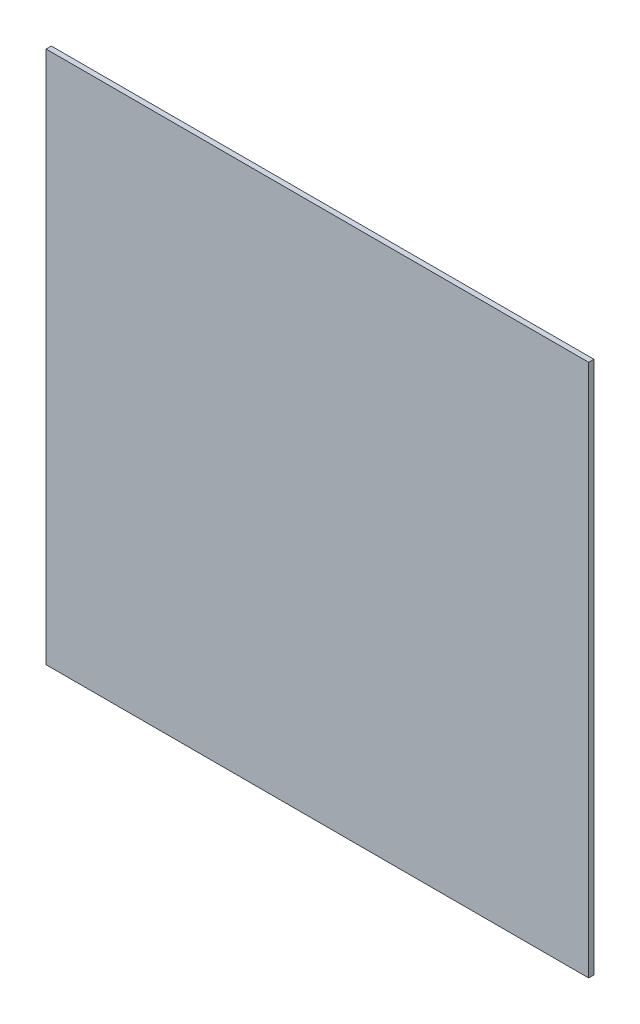
ISO-10303-21;
HEADER;
FILE_DESCRIPTION(('STEP AP214'),'2;1');
FILE_NAME('part.step','',(''),(''),'','','');
FILE_SCHEMA(('AUTOMOTIVE_DESIGN { 1 0 10303 214 1 1 1 1 }'));
ENDSEC;
DATA;
#1=APPLICATION_CONTEXT('core data for automotive mechanical design processes');
#2=APPLICATION_PROTOCOL_DEFINITION('international standard','automotive_design',2000,#1);
#3=PRODUCT_CONTEXT('',#1,'mechanical');
#4=PRODUCT('Part','Part','',(#3));
#5=PRODUCT_RELATED_PRODUCT_CATEGORY('part','',(#4));
#6=PRODUCT_DEFINITION_FORMATION('','',#4);
#7=PRODUCT_DEFINITION_CONTEXT('part definition',#1,'design');
#8=PRODUCT_DEFINITION('design','',#6,#7);
#9=PRODUCT_DEFINITION_SHAPE('','',#8);
#10=(LENGTH_UNIT() NAMED_UNIT(*) SI_UNIT(.MILLI.,.METRE.));
#11=(NAMED_UNIT(*) PLANE_ANGLE_UNIT() SI_UNIT($,.RADIAN.));
#12=(NAMED_UNIT(*) SI_UNIT($,.STERADIAN.) SOLID_ANGLE_UNIT());
#13=UNCERTAINTY_MEASURE_WITH_UNIT(LENGTH_MEASURE(1.E-05),#10,'distance_accuracy_value','');
#14=(GEOMETRIC_REPRESENTATION_CONTEXT(3) GLOBAL_UNCERTAINTY_ASSIGNED_CONTEXT((#13)) GLOBAL_UNIT_ASSIGNED_CONTEXT((#10,
#11,#12)) REPRESENTATION_CONTEXT('',''));
#15=CARTESIAN_POINT('',(0.,0.,0.));
#16=DIRECTION('',(0.,0.,1.));
#17=DIRECTION('',(1.,0.,0.));
#18=AXIS2_PLACEMENT_3D('',#15,#16,#17);
#19=CARTESIAN_POINT('',(-41.027985029072,64.7789107289107,1.));
#20=DIRECTION('',(1.,0.,0.));
#21=DIRECTION('',(0.,1.,0.));
#22=AXIS2_PLACEMENT_3D('',#19,#20,#21);
#23=PLANE('',#22);
#24=DIRECTION('',(0.,-1.,0.));
#25=VECTOR('',#24,1.);
#26=CARTESIAN_POINT('',(-41.027985029072,64.7789107289107,0.));
#27=LINE('',#26,#25);
#28=CARTESIAN_POINT('',(-41.027985029072,64.7789107289107,0.));
#29=VERTEX_POINT('',#28);
#30=CARTESIAN_POINT('',(-41.027985029072,-37.2210892710893,0.));
#31=VERTEX_POINT('',#30);
#32=EDGE_CURVE('E95',#29,#31,#27,.T.);
#33=ORIENTED_EDGE('',*,*,#32,.T.);
#34=DIRECTION('',(0.,0.,-1.));
#35=VECTOR('',#34,1.);
#36=CARTESIAN_POINT('',(-41.027985029072,-37.2210892710893,1.));
#37=LINE('',#36,#35);
#38=CARTESIAN_POINT('',(-41.027985029072,-37.2210892710893,1.));
#39=VERTEX_POINT('',#38);
#40=EDGE_CURVE('E11',#39,#31,#37,.T.);
#41=ORIENTED_EDGE('',*,*,#40,.F.);
#42=DIRECTION('',(0.,-1.,0.));
#43=VECTOR('',#42,1.);
#44=CARTESIAN_POINT('',(-41.027985029072,64.7789107289107,1.));
#45=LINE('',#44,#43);
#46=CARTESIAN_POINT('',(-41.027985029072,64.7789107289107,1.));
#47=VERTEX_POINT('',#46);
#48=EDGE_CURVE('E83',#47,#39,#45,.T.);
#49=ORIENTED_EDGE('',*,*,#48,.F.);
#50=DIRECTION('',(0.,0.,-1.));
#51=VECTOR('',#50,1.);
#52=CARTESIAN_POINT('',(-41.027985029072,64.7789107289107,1.));
#53=LINE('',#52,#51);
#54=EDGE_CURVE('E91',#47,#29,#53,.T.);
#55=ORIENTED_EDGE('',*,*,#54,.T.);
#56=EDGE_LOOP('',(#33,#41,#49,#55));
#57=FACE_BOUND('',#56,.T.);
#58=ADVANCED_FACE('F32',(#57),#23,.F.);
#59=CARTESIAN_POINT('',(-41.027985029072,-37.2210892710893,1.));
#60=DIRECTION('',(0.,1.,0.));
#61=DIRECTION('',(0.,0.,1.));
#62=AXIS2_PLACEMENT_3D('',#59,#60,#61);
#63=PLANE('',#62);
#64=DIRECTION('',(1.,0.,0.));
#65=VECTOR('',#64,1.);
#66=CARTESIAN_POINT('',(-41.027985029072,-37.2210892710893,0.));
#67=LINE('',#66,#65);
#68=CARTESIAN_POINT('',(62.772014970928,-37.2210892710893,0.));
#69=VERTEX_POINT('',#68);
#70=EDGE_CURVE('E87',#31,#69,#67,.T.);
#71=ORIENTED_EDGE('',*,*,#70,.T.);
#72=DIRECTION('',(0.,0.,-1.));
#73=VECTOR('',#72,1.);
#74=CARTESIAN_POINT('',(62.772014970928,-37.2210892710893,1.));
#75=LINE('',#74,#73);
#76=CARTESIAN_POINT('',(62.772014970928,-37.2210892710893,1.));
#77=VERTEX_POINT('',#76);
#78=EDGE_CURVE('E40',#77,#69,#75,.T.);
#79=ORIENTED_EDGE('',*,*,#78,.F.);
#80=DIRECTION('',(1.,0.,0.));
#81=VECTOR('',#80,1.);
#82=CARTESIAN_POINT('',(-41.027985029072,-37.2210892710893,1.));
#83=LINE('',#82,#81);
#84=EDGE_CURVE('E78',#39,#77,#83,.T.);
#85=ORIENTED_EDGE('',*,*,#84,.F.);
#86=ORIENTED_EDGE('',*,*,#40,.T.);
#87=EDGE_LOOP('',(#71,#79,#85,#86));
#88=FACE_BOUND('',#87,.T.);
#89=ADVANCED_FACE('F86',(#88),#63,.F.);
#90=CARTESIAN_POINT('',(62.772014970928,64.7789107289107,1.));
#91=DIRECTION('',(-1.,0.,0.));
#92=DIRECTION('',(0.,-1.,0.));
#93=AXIS2_PLACEMENT_3D('',#90,#91,#92);
#94=PLANE('',#93);
#95=DIRECTION('',(0.,1.,0.));
#96=VECTOR('',#95,1.);
#97=CARTESIAN_POINT('',(62.772014970928,64.7789107289107,0.));
#98=LINE('',#97,#96);
#99=CARTESIAN_POINT('',(62.772014970928,64.7789107289107,0.));
#100=VERTEX_POINT('',#99);
#101=EDGE_CURVE('E65',#69,#100,#98,.T.);
#102=ORIENTED_EDGE('',*,*,#101,.T.);
#103=DIRECTION('',(0.,0.,-1.));
#104=VECTOR('',#103,1.);
#105=CARTESIAN_POINT('',(62.772014970928,64.7789107289107,1.));
#106=LINE('',#105,#104);
#107=CARTESIAN_POINT('',(62.772014970928,64.7789107289107,1.));
#108=VERTEX_POINT('',#107);
#109=EDGE_CURVE('E88',#108,#100,#106,.T.);
#110=ORIENTED_EDGE('',*,*,#109,.F.);
#111=DIRECTION('',(0.,1.,0.));
#112=VECTOR('',#111,1.);
#113=CARTESIAN_POINT('',(62.772014970928,64.7789107289107,1.));
#114=LINE('',#113,#112);
#115=EDGE_CURVE('E81',#77,#108,#114,.T.);
#116=ORIENTED_EDGE('',*,*,#115,.F.);
#117=ORIENTED_EDGE('',*,*,#78,.T.);
#118=EDGE_LOOP('',(#102,#110,#116,#117));
#119=FACE_BOUND('',#118,.T.);
#120=ADVANCED_FACE('F89',(#119),#94,.F.);
#121=CARTESIAN_POINT('',(-41.027985029072,64.7789107289107,1.));
#122=DIRECTION('',(0.,-1.,0.));
#123=DIRECTION('',(0.,0.,-1.));
#124=AXIS2_PLACEMENT_3D('',#121,#122,#123);
#125=PLANE('',#124);
#126=DIRECTION('',(-1.,0.,0.));
#127=VECTOR('',#126,1.);
#128=CARTESIAN_POINT('',(-41.027985029072,64.7789107289107,0.));
#129=LINE('',#128,#127);
#130=EDGE_CURVE('E71',#100,#29,#129,.T.);
#131=ORIENTED_EDGE('',*,*,#130,.T.);
#132=ORIENTED_EDGE('',*,*,#54,.F.);
#133=DIRECTION('',(-1.,0.,0.));
#134=VECTOR('',#133,1.);
#135=CARTESIAN_POINT('',(-41.027985029072,64.7789107289107,1.));
#136=LINE('',#135,#134);
#137=EDGE_CURVE('E48',#108,#47,#136,.T.);
#138=ORIENTED_EDGE('',*,*,#137,.F.);
#139=ORIENTED_EDGE('',*,*,#109,.T.);
#140=EDGE_LOOP('',(#131,#132,#138,#139));
#141=FACE_BOUND('',#140,.T.);
#142=ADVANCED_FACE('F102',(#141),#125,.F.);
#143=CARTESIAN_POINT('',(0.,0.,1.));
#144=DIRECTION('',(0.,0.,1.));
#145=DIRECTION('',(1.,0.,0.));
#146=AXIS2_PLACEMENT_3D('',#143,#144,#145);
#147=PLANE('',#146);
#148=ORIENTED_EDGE('',*,*,#48,.T.);
#149=ORIENTED_EDGE('',*,*,#84,.T.);
#150=ORIENTED_EDGE('',*,*,#115,.T.);
#151=ORIENTED_EDGE('',*,*,#137,.T.);
#152=EDGE_LOOP('',(#148,#149,#150,#151));
#153=FACE_BOUND('',#152,.T.);
#154=ADVANCED_FACE('F79',(#153),#147,.T.);
#155=CARTESIAN_POINT('',(0.,0.,0.));
#156=DIRECTION('',(0.,0.,1.));
#157=DIRECTION('',(1.,0.,0.));
#158=AXIS2_PLACEMENT_3D('',#155,#156,#157);
#159=PLANE('',#158);
#160=ORIENTED_EDGE('',*,*,#32,.F.);
#161=ORIENTED_EDGE('',*,*,#130,.F.);
#162=ORIENTED_EDGE('',*,*,#101,.F.);
#163=ORIENTED_EDGE('',*,*,#70,.F.);
#164=EDGE_LOOP('',(#160,#161,#162,#163));
#165=FACE_BOUND('',#164,.T.);
#166=ADVANCED_FACE('F105',(#165),#159,.F.);
#167=CLOSED_SHELL('',(#58,#89,#120,#142,#154,#166));
#168=MANIFOLD_SOLID_BREP('B2',#167);
#169=ADVANCED_BREP_SHAPE_REPRESENTATION('',(#18,#168),#14);
#170=SHAPE_DEFINITION_REPRESENTATION(#9,#169);
ENDSEC;
END-ISO-10303-21;
